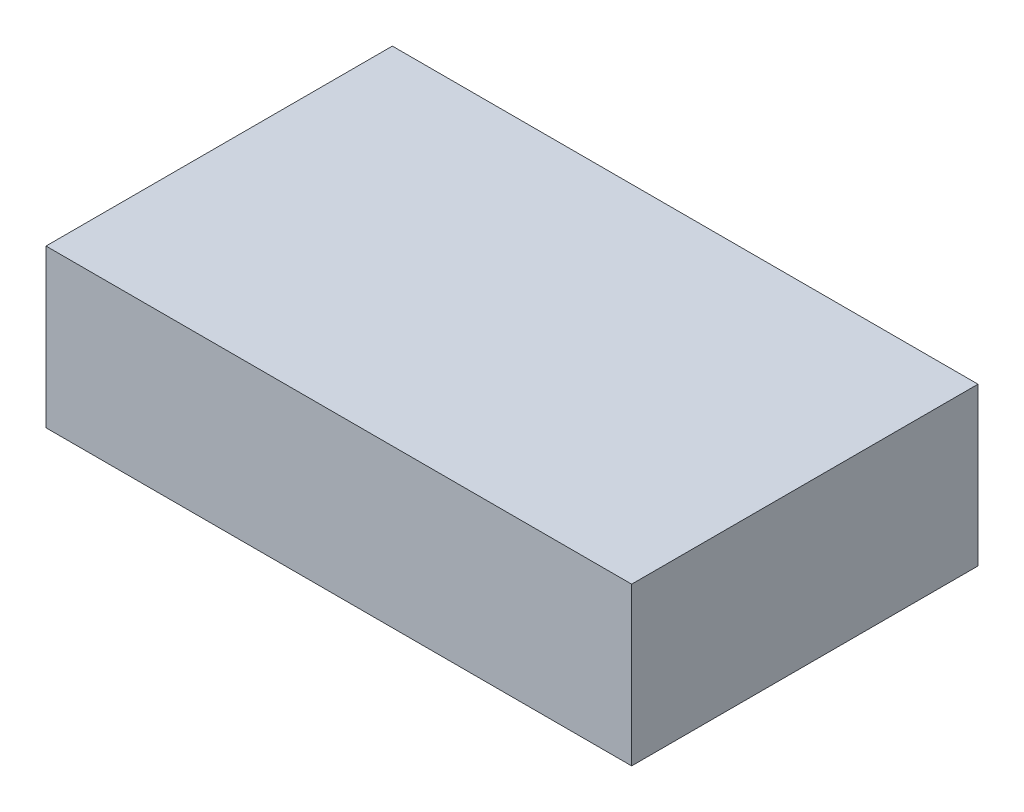
ISO-10303-21;
HEADER;
FILE_DESCRIPTION(('STEP AP214'),'2;1');
FILE_NAME('part.step','',(''),(''),'','','');
FILE_SCHEMA(('AUTOMOTIVE_DESIGN { 1 0 10303 214 1 1 1 1 }'));
ENDSEC;
DATA;
#1=APPLICATION_CONTEXT('core data for automotive mechanical design processes');
#2=APPLICATION_PROTOCOL_DEFINITION('international standard','automotive_design',2000,#1);
#3=PRODUCT_CONTEXT('',#1,'mechanical');
#4=PRODUCT('Part','Part','',(#3));
#5=PRODUCT_RELATED_PRODUCT_CATEGORY('part','',(#4));
#6=PRODUCT_DEFINITION_FORMATION('','',#4);
#7=PRODUCT_DEFINITION_CONTEXT('part definition',#1,'design');
#8=PRODUCT_DEFINITION('design','',#6,#7);
#9=PRODUCT_DEFINITION_SHAPE('','',#8);
#10=(LENGTH_UNIT() NAMED_UNIT(*) SI_UNIT(.MILLI.,.METRE.));
#11=(NAMED_UNIT(*) PLANE_ANGLE_UNIT() SI_UNIT($,.RADIAN.));
#12=(NAMED_UNIT(*) SI_UNIT($,.STERADIAN.) SOLID_ANGLE_UNIT());
#13=UNCERTAINTY_MEASURE_WITH_UNIT(LENGTH_MEASURE(1.E-05),#10,'distance_accuracy_value','');
#14=(GEOMETRIC_REPRESENTATION_CONTEXT(3) GLOBAL_UNCERTAINTY_ASSIGNED_CONTEXT((#13)) GLOBAL_UNIT_ASSIGNED_CONTEXT((#10,
#11,#12)) REPRESENTATION_CONTEXT('',''));
#15=CARTESIAN_POINT('',(0.,0.,0.));
#16=DIRECTION('',(0.,0.,1.));
#17=DIRECTION('',(1.,0.,0.));
#18=AXIS2_PLACEMENT_3D('',#15,#16,#17);
#19=CARTESIAN_POINT('',(0.,25.,0.));
#20=DIRECTION('',(1.,0.,0.));
#21=DIRECTION('',(0.,0.,-1.));
#22=AXIS2_PLACEMENT_3D('',#19,#20,#21);
#23=PLANE('',#22);
#24=DIRECTION('',(0.,0.,1.));
#25=VECTOR('',#24,1.);
#26=CARTESIAN_POINT('',(0.,0.,0.));
#27=LINE('',#26,#25);
#28=CARTESIAN_POINT('',(0.,0.,-55.));
#29=VERTEX_POINT('',#28);
#30=CARTESIAN_POINT('',(0.,0.,0.));
#31=VERTEX_POINT('',#30);
#32=EDGE_CURVE('E161',#29,#31,#27,.T.);
#33=ORIENTED_EDGE('',*,*,#32,.T.);
#34=DIRECTION('',(0.,-1.,0.));
#35=VECTOR('',#34,1.);
#36=CARTESIAN_POINT('',(0.,25.,0.));
#37=LINE('',#36,#35);
#38=CARTESIAN_POINT('',(0.,25.,0.));
#39=VERTEX_POINT('',#38);
#40=EDGE_CURVE('E11',#39,#31,#37,.T.);
#41=ORIENTED_EDGE('',*,*,#40,.F.);
#42=DIRECTION('',(0.,0.,1.));
#43=VECTOR('',#42,1.);
#44=CARTESIAN_POINT('',(0.,25.,0.));
#45=LINE('',#44,#43);
#46=CARTESIAN_POINT('',(0.,25.,-55.));
#47=VERTEX_POINT('',#46);
#48=EDGE_CURVE('E169',#47,#39,#45,.T.);
#49=ORIENTED_EDGE('',*,*,#48,.F.);
#50=DIRECTION('',(0.,-1.,0.));
#51=VECTOR('',#50,1.);
#52=CARTESIAN_POINT('',(0.,25.,-55.));
#53=LINE('',#52,#51);
#54=EDGE_CURVE('E179',#47,#29,#53,.T.);
#55=ORIENTED_EDGE('',*,*,#54,.T.);
#56=EDGE_LOOP('',(#33,#41,#49,#55));
#57=FACE_BOUND('',#56,.T.);
#58=DIRECTION('',(0.,0.,1.));
#59=VECTOR('',#58,1.);
#60=CARTESIAN_POINT('',(0.,2.,0.));
#61=LINE('',#60,#59);
#62=CARTESIAN_POINT('',(0.,2.,-53.));
#63=VERTEX_POINT('',#62);
#64=CARTESIAN_POINT('',(0.,2.,-2.));
#65=VERTEX_POINT('',#64);
#66=EDGE_CURVE('E124',#63,#65,#61,.T.);
#67=ORIENTED_EDGE('',*,*,#66,.F.);
#68=DIRECTION('',(0.,-1.,0.));
#69=VECTOR('',#68,1.);
#70=CARTESIAN_POINT('',(0.,25.,-53.));
#71=LINE('',#70,#69);
#72=CARTESIAN_POINT('',(0.,23.,-53.));
#73=VERTEX_POINT('',#72);
#74=EDGE_CURVE('E152',#73,#63,#71,.T.);
#75=ORIENTED_EDGE('',*,*,#74,.F.);
#76=DIRECTION('',(0.,0.,1.));
#77=VECTOR('',#76,1.);
#78=CARTESIAN_POINT('',(0.,23.,0.));
#79=LINE('',#78,#77);
#80=CARTESIAN_POINT('',(0.,23.,-2.));
#81=VERTEX_POINT('',#80);
#82=EDGE_CURVE('E58',#73,#81,#79,.T.);
#83=ORIENTED_EDGE('',*,*,#82,.T.);
#84=DIRECTION('',(0.,-1.,0.));
#85=VECTOR('',#84,1.);
#86=CARTESIAN_POINT('',(0.,25.,-2.));
#87=LINE('',#86,#85);
#88=EDGE_CURVE('E137',#81,#65,#87,.T.);
#89=ORIENTED_EDGE('',*,*,#88,.T.);
#90=EDGE_LOOP('',(#67,#75,#83,#89));
#91=FACE_BOUND('',#90,.T.);
#92=ADVANCED_FACE('F43',(#57,#91),#23,.F.);
#93=CARTESIAN_POINT('',(0.,25.,0.));
#94=DIRECTION('',(0.,0.,-1.));
#95=DIRECTION('',(-1.,0.,0.));
#96=AXIS2_PLACEMENT_3D('',#93,#94,#95);
#97=PLANE('',#96);
#98=DIRECTION('',(1.,0.,0.));
#99=VECTOR('',#98,1.);
#100=CARTESIAN_POINT('',(0.,0.,0.));
#101=LINE('',#100,#99);
#102=CARTESIAN_POINT('',(93.,0.,0.));
#103=VERTEX_POINT('',#102);
#104=EDGE_CURVE('E183',#31,#103,#101,.T.);
#105=ORIENTED_EDGE('',*,*,#104,.T.);
#106=DIRECTION('',(0.,-1.,0.));
#107=VECTOR('',#106,1.);
#108=CARTESIAN_POINT('',(93.,25.,0.));
#109=LINE('',#108,#107);
#110=CARTESIAN_POINT('',(93.,25.,0.));
#111=VERTEX_POINT('',#110);
#112=EDGE_CURVE('E51',#111,#103,#109,.T.);
#113=ORIENTED_EDGE('',*,*,#112,.F.);
#114=DIRECTION('',(1.,0.,0.));
#115=VECTOR('',#114,1.);
#116=CARTESIAN_POINT('',(0.,25.,0.));
#117=LINE('',#116,#115);
#118=EDGE_CURVE('E95',#39,#111,#117,.T.);
#119=ORIENTED_EDGE('',*,*,#118,.F.);
#120=ORIENTED_EDGE('',*,*,#40,.T.);
#121=EDGE_LOOP('',(#105,#113,#119,#120));
#122=FACE_BOUND('',#121,.T.);
#123=ADVANCED_FACE('F218',(#122),#97,.F.);
#124=CARTESIAN_POINT('',(93.,25.,0.));
#125=DIRECTION('',(-1.,0.,0.));
#126=DIRECTION('',(0.,0.,1.));
#127=AXIS2_PLACEMENT_3D('',#124,#125,#126);
#128=PLANE('',#127);
#129=DIRECTION('',(0.,0.,-1.));
#130=VECTOR('',#129,1.);
#131=CARTESIAN_POINT('',(93.,0.,0.));
#132=LINE('',#131,#130);
#133=CARTESIAN_POINT('',(93.,0.,-55.));
#134=VERTEX_POINT('',#133);
#135=EDGE_CURVE('E186',#103,#134,#132,.T.);
#136=ORIENTED_EDGE('',*,*,#135,.T.);
#137=DIRECTION('',(0.,-1.,0.));
#138=VECTOR('',#137,1.);
#139=CARTESIAN_POINT('',(93.,25.,-55.));
#140=LINE('',#139,#138);
#141=CARTESIAN_POINT('',(93.,25.,-55.));
#142=VERTEX_POINT('',#141);
#143=EDGE_CURVE('E193',#142,#134,#140,.T.);
#144=ORIENTED_EDGE('',*,*,#143,.F.);
#145=DIRECTION('',(0.,0.,-1.));
#146=VECTOR('',#145,1.);
#147=CARTESIAN_POINT('',(93.,25.,0.));
#148=LINE('',#147,#146);
#149=EDGE_CURVE('E174',#111,#142,#148,.T.);
#150=ORIENTED_EDGE('',*,*,#149,.F.);
#151=ORIENTED_EDGE('',*,*,#112,.T.);
#152=EDGE_LOOP('',(#136,#144,#150,#151));
#153=FACE_BOUND('',#152,.T.);
#154=ADVANCED_FACE('F200',(#153),#128,.F.);
#155=CARTESIAN_POINT('',(0.,25.,-55.));
#156=DIRECTION('',(0.,0.,1.));
#157=DIRECTION('',(1.,0.,0.));
#158=AXIS2_PLACEMENT_3D('',#155,#156,#157);
#159=PLANE('',#158);
#160=DIRECTION('',(-1.,0.,0.));
#161=VECTOR('',#160,1.);
#162=CARTESIAN_POINT('',(0.,0.,-55.));
#163=LINE('',#162,#161);
#164=EDGE_CURVE('E88',#134,#29,#163,.T.);
#165=ORIENTED_EDGE('',*,*,#164,.T.);
#166=ORIENTED_EDGE('',*,*,#54,.F.);
#167=DIRECTION('',(-1.,0.,0.));
#168=VECTOR('',#167,1.);
#169=CARTESIAN_POINT('',(0.,25.,-55.));
#170=LINE('',#169,#168);
#171=EDGE_CURVE('E67',#142,#47,#170,.T.);
#172=ORIENTED_EDGE('',*,*,#171,.F.);
#173=ORIENTED_EDGE('',*,*,#143,.T.);
#174=EDGE_LOOP('',(#165,#166,#172,#173));
#175=FACE_BOUND('',#174,.T.);
#176=ADVANCED_FACE('F209',(#175),#159,.F.);
#177=CARTESIAN_POINT('',(0.,25.,0.));
#178=DIRECTION('',(0.,-1.,0.));
#179=DIRECTION('',(0.,0.,-1.));
#180=AXIS2_PLACEMENT_3D('',#177,#178,#179);
#181=PLANE('',#180);
#182=ORIENTED_EDGE('',*,*,#48,.T.);
#183=ORIENTED_EDGE('',*,*,#118,.T.);
#184=ORIENTED_EDGE('',*,*,#149,.T.);
#185=ORIENTED_EDGE('',*,*,#171,.T.);
#186=EDGE_LOOP('',(#182,#183,#184,#185));
#187=FACE_BOUND('',#186,.T.);
#188=ADVANCED_FACE('F211',(#187),#181,.F.);
#189=CARTESIAN_POINT('',(0.,0.,0.));
#190=DIRECTION('',(0.,-1.,0.));
#191=DIRECTION('',(0.,0.,-1.));
#192=AXIS2_PLACEMENT_3D('',#189,#190,#191);
#193=PLANE('',#192);
#194=ORIENTED_EDGE('',*,*,#32,.F.);
#195=ORIENTED_EDGE('',*,*,#164,.F.);
#196=ORIENTED_EDGE('',*,*,#135,.F.);
#197=ORIENTED_EDGE('',*,*,#104,.F.);
#198=EDGE_LOOP('',(#194,#195,#196,#197));
#199=FACE_BOUND('',#198,.T.);
#200=ADVANCED_FACE('F204',(#199),#193,.T.);
#201=CARTESIAN_POINT('',(0.,25.,-2.));
#202=DIRECTION('',(0.,0.,-1.));
#203=DIRECTION('',(-1.,0.,0.));
#204=AXIS2_PLACEMENT_3D('',#201,#202,#203);
#205=PLANE('',#204);
#206=DIRECTION('',(1.,0.,0.));
#207=VECTOR('',#206,1.);
#208=CARTESIAN_POINT('',(0.,2.,-2.));
#209=LINE('',#208,#207);
#210=CARTESIAN_POINT('',(91.,2.,-2.));
#211=VERTEX_POINT('',#210);
#212=EDGE_CURVE('E117',#65,#211,#209,.T.);
#213=ORIENTED_EDGE('',*,*,#212,.F.);
#214=ORIENTED_EDGE('',*,*,#88,.F.);
#215=DIRECTION('',(1.,0.,0.));
#216=VECTOR('',#215,1.);
#217=CARTESIAN_POINT('',(0.,23.,-2.));
#218=LINE('',#217,#216);
#219=CARTESIAN_POINT('',(91.,23.,-2.));
#220=VERTEX_POINT('',#219);
#221=EDGE_CURVE('E133',#81,#220,#218,.T.);
#222=ORIENTED_EDGE('',*,*,#221,.T.);
#223=DIRECTION('',(0.,-1.,0.));
#224=VECTOR('',#223,1.);
#225=CARTESIAN_POINT('',(91.,25.,-2.));
#226=LINE('',#225,#224);
#227=EDGE_CURVE('E131',#220,#211,#226,.T.);
#228=ORIENTED_EDGE('',*,*,#227,.T.);
#229=EDGE_LOOP('',(#213,#214,#222,#228));
#230=FACE_BOUND('',#229,.T.);
#231=ADVANCED_FACE('F132',(#230),#205,.T.);
#232=CARTESIAN_POINT('',(91.,25.,0.));
#233=DIRECTION('',(-1.,0.,0.));
#234=DIRECTION('',(0.,0.,1.));
#235=AXIS2_PLACEMENT_3D('',#232,#233,#234);
#236=PLANE('',#235);
#237=DIRECTION('',(0.,0.,-1.));
#238=VECTOR('',#237,1.);
#239=CARTESIAN_POINT('',(91.,2.,0.));
#240=LINE('',#239,#238);
#241=CARTESIAN_POINT('',(91.,2.,-53.));
#242=VERTEX_POINT('',#241);
#243=EDGE_CURVE('E121',#211,#242,#240,.T.);
#244=ORIENTED_EDGE('',*,*,#243,.F.);
#245=ORIENTED_EDGE('',*,*,#227,.F.);
#246=DIRECTION('',(0.,0.,-1.));
#247=VECTOR('',#246,1.);
#248=CARTESIAN_POINT('',(91.,23.,0.));
#249=LINE('',#248,#247);
#250=CARTESIAN_POINT('',(91.,23.,-53.));
#251=VERTEX_POINT('',#250);
#252=EDGE_CURVE('E153',#220,#251,#249,.T.);
#253=ORIENTED_EDGE('',*,*,#252,.T.);
#254=DIRECTION('',(0.,-1.,0.));
#255=VECTOR('',#254,1.);
#256=CARTESIAN_POINT('',(91.,25.,-53.));
#257=LINE('',#256,#255);
#258=EDGE_CURVE('E138',#251,#242,#257,.T.);
#259=ORIENTED_EDGE('',*,*,#258,.T.);
#260=EDGE_LOOP('',(#244,#245,#253,#259));
#261=FACE_BOUND('',#260,.T.);
#262=ADVANCED_FACE('F140',(#261),#236,.T.);
#263=CARTESIAN_POINT('',(0.,25.,-53.));
#264=DIRECTION('',(0.,0.,1.));
#265=DIRECTION('',(1.,0.,0.));
#266=AXIS2_PLACEMENT_3D('',#263,#264,#265);
#267=PLANE('',#266);
#268=DIRECTION('',(-1.,0.,0.));
#269=VECTOR('',#268,1.);
#270=CARTESIAN_POINT('',(0.,2.,-53.));
#271=LINE('',#270,#269);
#272=EDGE_CURVE('E144',#242,#63,#271,.T.);
#273=ORIENTED_EDGE('',*,*,#272,.F.);
#274=ORIENTED_EDGE('',*,*,#258,.F.);
#275=DIRECTION('',(-1.,0.,0.));
#276=VECTOR('',#275,1.);
#277=CARTESIAN_POINT('',(0.,23.,-53.));
#278=LINE('',#277,#276);
#279=EDGE_CURVE('E155',#251,#73,#278,.T.);
#280=ORIENTED_EDGE('',*,*,#279,.T.);
#281=ORIENTED_EDGE('',*,*,#74,.T.);
#282=EDGE_LOOP('',(#273,#274,#280,#281));
#283=FACE_BOUND('',#282,.T.);
#284=ADVANCED_FACE('F274',(#283),#267,.T.);
#285=CARTESIAN_POINT('',(0.,23.,0.));
#286=DIRECTION('',(0.,-1.,0.));
#287=DIRECTION('',(0.,0.,-1.));
#288=AXIS2_PLACEMENT_3D('',#285,#286,#287);
#289=PLANE('',#288);
#290=ORIENTED_EDGE('',*,*,#82,.F.);
#291=ORIENTED_EDGE('',*,*,#279,.F.);
#292=ORIENTED_EDGE('',*,*,#252,.F.);
#293=ORIENTED_EDGE('',*,*,#221,.F.);
#294=EDGE_LOOP('',(#290,#291,#292,#293));
#295=FACE_BOUND('',#294,.T.);
#296=ADVANCED_FACE('F284',(#295),#289,.T.);
#297=CARTESIAN_POINT('',(0.,2.,0.));
#298=DIRECTION('',(0.,-1.,0.));
#299=DIRECTION('',(0.,0.,-1.));
#300=AXIS2_PLACEMENT_3D('',#297,#298,#299);
#301=PLANE('',#300);
#302=ORIENTED_EDGE('',*,*,#66,.T.);
#303=ORIENTED_EDGE('',*,*,#212,.T.);
#304=ORIENTED_EDGE('',*,*,#243,.T.);
#305=ORIENTED_EDGE('',*,*,#272,.T.);
#306=EDGE_LOOP('',(#302,#303,#304,#305));
#307=FACE_BOUND('',#306,.T.);
#308=ADVANCED_FACE('F119',(#307),#301,.F.);
#309=CLOSED_SHELL('',(#92,#123,#154,#176,#188,#200,#231,#262,#284,#296,#308));
#310=MANIFOLD_SOLID_BREP('B2',#309);
#311=ADVANCED_BREP_SHAPE_REPRESENTATION('',(#18,#310),#14);
#312=SHAPE_DEFINITION_REPRESENTATION(#9,#311);
ENDSEC;
END-ISO-10303-21;
